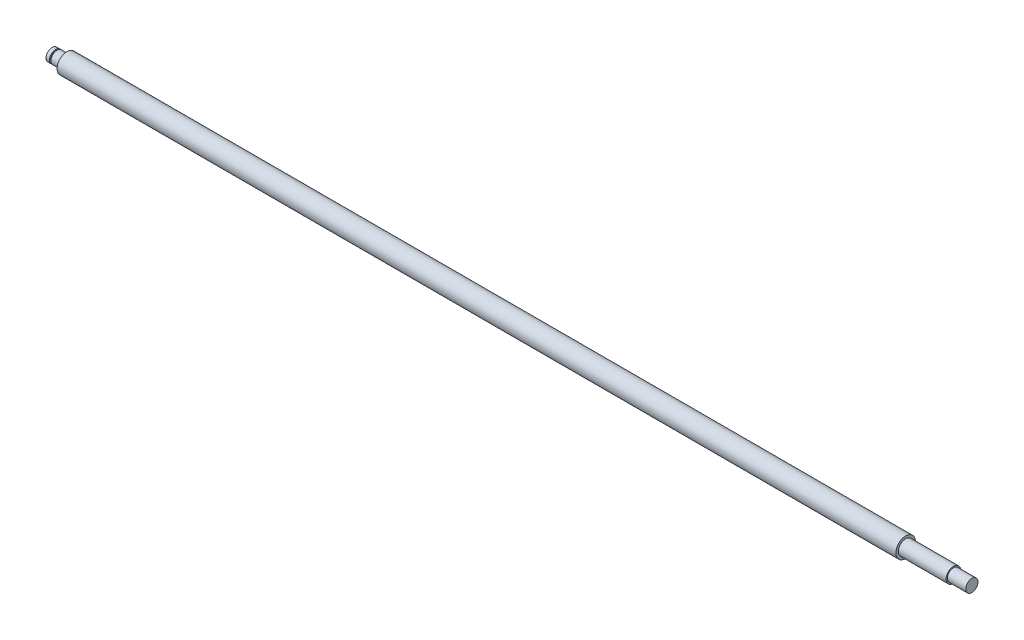
ISO-10303-21;
HEADER;
FILE_DESCRIPTION(('STEP AP214'),'2;1');
FILE_NAME('part.step','',(''),(''),'','','');
FILE_SCHEMA(('AUTOMOTIVE_DESIGN { 1 0 10303 214 1 1 1 1 }'));
ENDSEC;
DATA;
#1=APPLICATION_CONTEXT('core data for automotive mechanical design processes');
#2=APPLICATION_PROTOCOL_DEFINITION('international standard','automotive_design',2000,#1);
#3=PRODUCT_CONTEXT('',#1,'mechanical');
#4=PRODUCT('Part','Part','',(#3));
#5=PRODUCT_RELATED_PRODUCT_CATEGORY('part','',(#4));
#6=PRODUCT_DEFINITION_FORMATION('','',#4);
#7=PRODUCT_DEFINITION_CONTEXT('part definition',#1,'design');
#8=PRODUCT_DEFINITION('design','',#6,#7);
#9=PRODUCT_DEFINITION_SHAPE('','',#8);
#10=(LENGTH_UNIT() NAMED_UNIT(*) SI_UNIT(.MILLI.,.METRE.));
#11=(NAMED_UNIT(*) PLANE_ANGLE_UNIT() SI_UNIT($,.RADIAN.));
#12=(NAMED_UNIT(*) SI_UNIT($,.STERADIAN.) SOLID_ANGLE_UNIT());
#13=UNCERTAINTY_MEASURE_WITH_UNIT(LENGTH_MEASURE(1.E-05),#10,'distance_accuracy_value','');
#14=(GEOMETRIC_REPRESENTATION_CONTEXT(3) GLOBAL_UNCERTAINTY_ASSIGNED_CONTEXT((#13)) GLOBAL_UNIT_ASSIGNED_CONTEXT((#10,
#11,#12)) REPRESENTATION_CONTEXT('',''));
#15=CARTESIAN_POINT('',(0.,0.,0.));
#16=DIRECTION('',(0.,0.,1.));
#17=DIRECTION('',(1.,0.,0.));
#18=AXIS2_PLACEMENT_3D('',#15,#16,#17);
#19=CARTESIAN_POINT('',(-88.2232860327094,0.,0.));
#20=DIRECTION('',(1.,0.,0.));
#21=DIRECTION('',(0.,0.,-1.));
#22=AXIS2_PLACEMENT_3D('',#19,#20,#21);
#23=PLANE('',#22);
#24=CARTESIAN_POINT('',(-88.2232860327094,0.,0.));
#25=DIRECTION('',(-1.,0.,0.));
#26=DIRECTION('',(0.,0.,1.));
#27=AXIS2_PLACEMENT_3D('',#24,#25,#26);
#28=CIRCLE('',#27,5.);
#29=CARTESIAN_POINT('',(-88.2232860327094,0.,5.));
#30=VERTEX_POINT('',#29);
#31=EDGE_CURVE('E10',#30,#30,#28,.T.);
#32=ORIENTED_EDGE('',*,*,#31,.T.);
#33=EDGE_LOOP('',(#32));
#34=FACE_BOUND('',#33,.T.);
#35=ADVANCED_FACE('F30',(#34),#23,.F.);
#36=CARTESIAN_POINT('',(-89.4005556379638,0.,0.));
#37=DIRECTION('',(-1.,0.,0.));
#38=DIRECTION('',(0.,0.,1.));
#39=AXIS2_PLACEMENT_3D('',#36,#37,#38);
#40=CYLINDRICAL_SURFACE('',#39,5.);
#41=ORIENTED_EDGE('',*,*,#31,.F.);
#42=EDGE_LOOP('',(#41));
#43=FACE_BOUND('',#42,.T.);
#44=CARTESIAN_POINT('',(-85.3698891216912,0.,0.));
#45=DIRECTION('',(-1.,0.,0.));
#46=DIRECTION('',(0.,0.,1.));
#47=AXIS2_PLACEMENT_3D('',#44,#45,#46);
#48=CIRCLE('',#47,5.);
#49=CARTESIAN_POINT('',(-85.3698891216912,0.,5.));
#50=VERTEX_POINT('',#49);
#51=EDGE_CURVE('E36',#50,#50,#48,.T.);
#52=ORIENTED_EDGE('',*,*,#51,.T.);
#53=EDGE_LOOP('',(#52));
#54=FACE_BOUND('',#53,.T.);
#55=ADVANCED_FACE('F86',(#43,#54),#40,.T.);
#56=CARTESIAN_POINT('',(-85.3698891216912,5.,0.));
#57=DIRECTION('',(-1.,0.,0.));
#58=DIRECTION('',(0.,0.,1.));
#59=AXIS2_PLACEMENT_3D('',#56,#57,#58);
#60=PLANE('',#59);
#61=ORIENTED_EDGE('',*,*,#51,.F.);
#62=EDGE_LOOP('',(#61));
#63=FACE_BOUND('',#62,.T.);
#64=CARTESIAN_POINT('',(-85.3698891216912,0.,0.));
#65=DIRECTION('',(-1.,0.,0.));
#66=DIRECTION('',(0.,0.,1.));
#67=AXIS2_PLACEMENT_3D('',#64,#65,#66);
#68=CIRCLE('',#67,4.);
#69=CARTESIAN_POINT('',(-85.3698891216912,0.,4.));
#70=VERTEX_POINT('',#69);
#71=EDGE_CURVE('E40',#70,#70,#68,.T.);
#72=ORIENTED_EDGE('',*,*,#71,.T.);
#73=EDGE_LOOP('',(#72));
#74=FACE_BOUND('',#73,.T.);
#75=ADVANCED_FACE('F90',(#63,#74),#60,.F.);
#76=CARTESIAN_POINT('',(-89.4005556379638,0.,0.));
#77=DIRECTION('',(-1.,0.,0.));
#78=DIRECTION('',(0.,0.,1.));
#79=AXIS2_PLACEMENT_3D('',#76,#77,#78);
#80=CYLINDRICAL_SURFACE('',#79,4.);
#81=ORIENTED_EDGE('',*,*,#71,.F.);
#82=EDGE_LOOP('',(#81));
#83=FACE_BOUND('',#82,.T.);
#84=CARTESIAN_POINT('',(-84.2198891216913,0.,0.));
#85=DIRECTION('',(-1.,0.,0.));
#86=DIRECTION('',(0.,0.,1.));
#87=AXIS2_PLACEMENT_3D('',#84,#85,#86);
#88=CIRCLE('',#87,4.);
#89=CARTESIAN_POINT('',(-84.2198891216913,0.,4.));
#90=VERTEX_POINT('',#89);
#91=EDGE_CURVE('E44',#90,#90,#88,.T.);
#92=ORIENTED_EDGE('',*,*,#91,.T.);
#93=EDGE_LOOP('',(#92));
#94=FACE_BOUND('',#93,.T.);
#95=ADVANCED_FACE('F95',(#83,#94),#80,.T.);
#96=CARTESIAN_POINT('',(-84.2198891216913,4.,0.));
#97=DIRECTION('',(1.,0.,0.));
#98=DIRECTION('',(0.,0.,-1.));
#99=AXIS2_PLACEMENT_3D('',#96,#97,#98);
#100=PLANE('',#99);
#101=ORIENTED_EDGE('',*,*,#91,.F.);
#102=EDGE_LOOP('',(#101));
#103=FACE_BOUND('',#102,.T.);
#104=CARTESIAN_POINT('',(-84.2198891216913,0.,0.));
#105=DIRECTION('',(-1.,0.,0.));
#106=DIRECTION('',(0.,0.,1.));
#107=AXIS2_PLACEMENT_3D('',#104,#105,#106);
#108=CIRCLE('',#107,5.);
#109=CARTESIAN_POINT('',(-84.2198891216913,0.,5.));
#110=VERTEX_POINT('',#109);
#111=EDGE_CURVE('E49',#110,#110,#108,.T.);
#112=ORIENTED_EDGE('',*,*,#111,.T.);
#113=EDGE_LOOP('',(#112));
#114=FACE_BOUND('',#113,.T.);
#115=ADVANCED_FACE('F101',(#103,#114),#100,.F.);
#116=CARTESIAN_POINT('',(-89.4005556379638,0.,0.));
#117=DIRECTION('',(-1.,0.,0.));
#118=DIRECTION('',(0.,0.,1.));
#119=AXIS2_PLACEMENT_3D('',#116,#117,#118);
#120=CYLINDRICAL_SURFACE('',#119,5.);
#121=ORIENTED_EDGE('',*,*,#111,.F.);
#122=EDGE_LOOP('',(#121));
#123=FACE_BOUND('',#122,.T.);
#124=CARTESIAN_POINT('',(-76.2198891216913,0.,0.));
#125=DIRECTION('',(-1.,0.,0.));
#126=DIRECTION('',(0.,0.,1.));
#127=AXIS2_PLACEMENT_3D('',#124,#125,#126);
#128=CIRCLE('',#127,5.);
#129=CARTESIAN_POINT('',(-76.2198891216913,0.,5.));
#130=VERTEX_POINT('',#129);
#131=EDGE_CURVE('E52',#130,#130,#128,.T.);
#132=ORIENTED_EDGE('',*,*,#131,.T.);
#133=EDGE_LOOP('',(#132));
#134=FACE_BOUND('',#133,.T.);
#135=ADVANCED_FACE('F105',(#123,#134),#120,.T.);
#136=CARTESIAN_POINT('',(-76.2198891216913,5.,0.));
#137=DIRECTION('',(1.,0.,0.));
#138=DIRECTION('',(0.,0.,-1.));
#139=AXIS2_PLACEMENT_3D('',#136,#137,#138);
#140=PLANE('',#139);
#141=ORIENTED_EDGE('',*,*,#131,.F.);
#142=EDGE_LOOP('',(#141));
#143=FACE_BOUND('',#142,.T.);
#144=CARTESIAN_POINT('',(-76.2198891216913,0.,0.));
#145=DIRECTION('',(-1.,0.,0.));
#146=DIRECTION('',(0.,0.,1.));
#147=AXIS2_PLACEMENT_3D('',#144,#145,#146);
#148=CIRCLE('',#147,8.);
#149=CARTESIAN_POINT('',(-76.2198891216913,0.,8.));
#150=VERTEX_POINT('',#149);
#151=EDGE_CURVE('E55',#150,#150,#148,.T.);
#152=ORIENTED_EDGE('',*,*,#151,.T.);
#153=EDGE_LOOP('',(#152));
#154=FACE_BOUND('',#153,.T.);
#155=ADVANCED_FACE('F109',(#143,#154),#140,.F.);
#156=CARTESIAN_POINT('',(-89.4005556379638,0.,0.));
#157=DIRECTION('',(-1.,0.,0.));
#158=DIRECTION('',(0.,0.,1.));
#159=AXIS2_PLACEMENT_3D('',#156,#157,#158);
#160=CYLINDRICAL_SURFACE('',#159,8.);
#161=ORIENTED_EDGE('',*,*,#151,.F.);
#162=EDGE_LOOP('',(#161));
#163=FACE_BOUND('',#162,.T.);
#164=CARTESIAN_POINT('',(607.780110878309,0.,0.));
#165=DIRECTION('',(-1.,0.,0.));
#166=DIRECTION('',(0.,0.,1.));
#167=AXIS2_PLACEMENT_3D('',#164,#165,#166);
#168=CIRCLE('',#167,8.);
#169=CARTESIAN_POINT('',(607.780110878309,0.,8.));
#170=VERTEX_POINT('',#169);
#171=EDGE_CURVE('E58',#170,#170,#168,.T.);
#172=ORIENTED_EDGE('',*,*,#171,.T.);
#173=EDGE_LOOP('',(#172));
#174=FACE_BOUND('',#173,.T.);
#175=ADVANCED_FACE('F113',(#163,#174),#160,.T.);
#176=CARTESIAN_POINT('',(607.780110878309,8.,0.));
#177=DIRECTION('',(-1.,0.,0.));
#178=DIRECTION('',(0.,0.,1.));
#179=AXIS2_PLACEMENT_3D('',#176,#177,#178);
#180=PLANE('',#179);
#181=ORIENTED_EDGE('',*,*,#171,.F.);
#182=EDGE_LOOP('',(#181));
#183=FACE_BOUND('',#182,.T.);
#184=CARTESIAN_POINT('',(607.780110878309,0.,0.));
#185=DIRECTION('',(-1.,0.,0.));
#186=DIRECTION('',(0.,0.,1.));
#187=AXIS2_PLACEMENT_3D('',#184,#185,#186);
#188=CIRCLE('',#187,6.);
#189=CARTESIAN_POINT('',(607.780110878309,0.,6.));
#190=VERTEX_POINT('',#189);
#191=EDGE_CURVE('E61',#190,#190,#188,.T.);
#192=ORIENTED_EDGE('',*,*,#191,.T.);
#193=EDGE_LOOP('',(#192));
#194=FACE_BOUND('',#193,.T.);
#195=ADVANCED_FACE('F117',(#183,#194),#180,.F.);
#196=CARTESIAN_POINT('',(-89.4005556379638,0.,0.));
#197=DIRECTION('',(-1.,0.,0.));
#198=DIRECTION('',(0.,0.,1.));
#199=AXIS2_PLACEMENT_3D('',#196,#197,#198);
#200=CYLINDRICAL_SURFACE('',#199,6.);
#201=ORIENTED_EDGE('',*,*,#191,.F.);
#202=EDGE_LOOP('',(#201));
#203=FACE_BOUND('',#202,.T.);
#204=CARTESIAN_POINT('',(646.780110878309,0.,0.));
#205=DIRECTION('',(-1.,0.,0.));
#206=DIRECTION('',(0.,0.,1.));
#207=AXIS2_PLACEMENT_3D('',#204,#205,#206);
#208=CIRCLE('',#207,6.);
#209=CARTESIAN_POINT('',(646.780110878309,0.,6.));
#210=VERTEX_POINT('',#209);
#211=EDGE_CURVE('E64',#210,#210,#208,.T.);
#212=ORIENTED_EDGE('',*,*,#211,.T.);
#213=EDGE_LOOP('',(#212));
#214=FACE_BOUND('',#213,.T.);
#215=ADVANCED_FACE('F121',(#203,#214),#200,.T.);
#216=CARTESIAN_POINT('',(646.780110878309,6.,0.));
#217=DIRECTION('',(-1.,0.,0.));
#218=DIRECTION('',(0.,0.,1.));
#219=AXIS2_PLACEMENT_3D('',#216,#217,#218);
#220=PLANE('',#219);
#221=ORIENTED_EDGE('',*,*,#211,.F.);
#222=EDGE_LOOP('',(#221));
#223=FACE_BOUND('',#222,.T.);
#224=CARTESIAN_POINT('',(646.780110878309,0.,0.));
#225=DIRECTION('',(-1.,0.,0.));
#226=DIRECTION('',(0.,0.,1.));
#227=AXIS2_PLACEMENT_3D('',#224,#225,#226);
#228=CIRCLE('',#227,5.);
#229=CARTESIAN_POINT('',(646.780110878309,0.,5.));
#230=VERTEX_POINT('',#229);
#231=EDGE_CURVE('E67',#230,#230,#228,.T.);
#232=ORIENTED_EDGE('',*,*,#231,.T.);
#233=EDGE_LOOP('',(#232));
#234=FACE_BOUND('',#233,.T.);
#235=ADVANCED_FACE('F82',(#223,#234),#220,.F.);
#236=CARTESIAN_POINT('',(-89.4005556379638,0.,0.));
#237=DIRECTION('',(-1.,0.,0.));
#238=DIRECTION('',(0.,0.,1.));
#239=AXIS2_PLACEMENT_3D('',#236,#237,#238);
#240=CYLINDRICAL_SURFACE('',#239,5.);
#241=ORIENTED_EDGE('',*,*,#231,.F.);
#242=EDGE_LOOP('',(#241));
#243=FACE_BOUND('',#242,.T.);
#244=CARTESIAN_POINT('',(661.780110878309,0.,0.));
#245=DIRECTION('',(-1.,0.,0.));
#246=DIRECTION('',(0.,0.,1.));
#247=AXIS2_PLACEMENT_3D('',#244,#245,#246);
#248=CIRCLE('',#247,5.);
#249=CARTESIAN_POINT('',(661.780110878309,0.,5.));
#250=VERTEX_POINT('',#249);
#251=EDGE_CURVE('E70',#250,#250,#248,.T.);
#252=ORIENTED_EDGE('',*,*,#251,.T.);
#253=EDGE_LOOP('',(#252));
#254=FACE_BOUND('',#253,.T.);
#255=ADVANCED_FACE('F74',(#243,#254),#240,.T.);
#256=CARTESIAN_POINT('',(661.780110878309,5.,0.));
#257=DIRECTION('',(-1.,0.,0.));
#258=DIRECTION('',(0.,0.,1.));
#259=AXIS2_PLACEMENT_3D('',#256,#257,#258);
#260=PLANE('',#259);
#261=ORIENTED_EDGE('',*,*,#251,.F.);
#262=EDGE_LOOP('',(#261));
#263=FACE_BOUND('',#262,.T.);
#264=ADVANCED_FACE('F76',(#263),#260,.F.);
#265=CLOSED_SHELL('',(#35,#55,#75,#95,#115,#135,#155,#175,#195,#215,#235,#255,#264));
#266=MANIFOLD_SOLID_BREP('B2',#265);
#267=ADVANCED_BREP_SHAPE_REPRESENTATION('',(#18,#266),#14);
#268=SHAPE_DEFINITION_REPRESENTATION(#9,#267);
ENDSEC;
END-ISO-10303-21;
